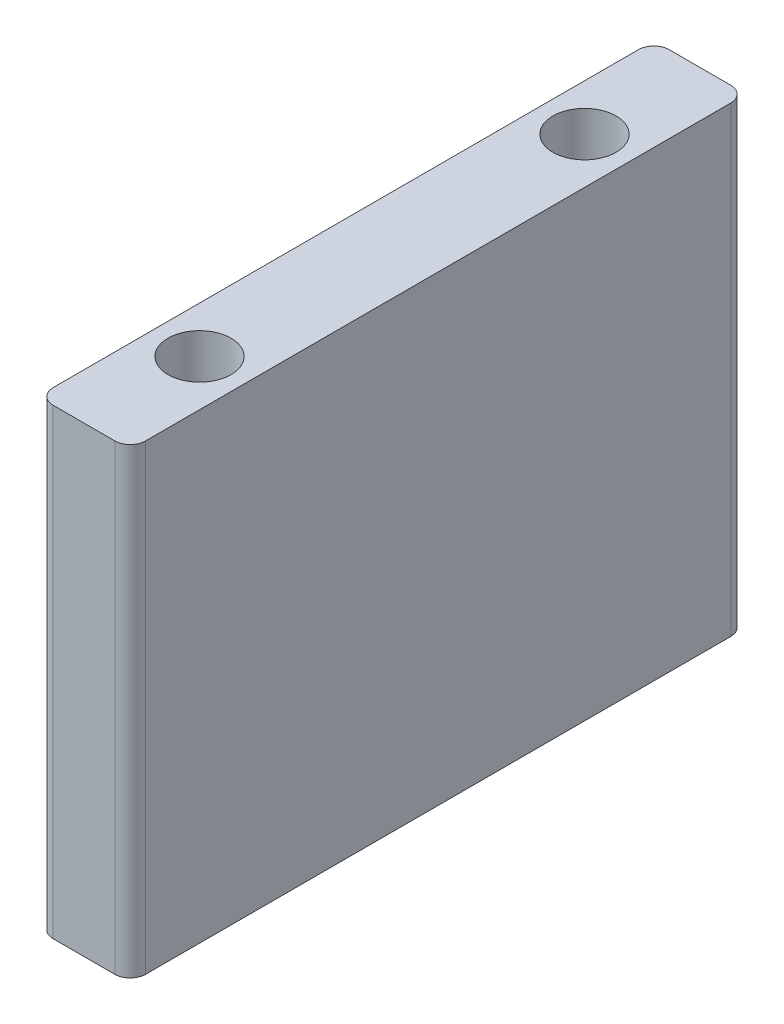
ISO-10303-21;
HEADER;
FILE_DESCRIPTION(('STEP AP214'),'2;1');
FILE_NAME('part.step','',(''),(''),'','','');
FILE_SCHEMA(('AUTOMOTIVE_DESIGN { 1 0 10303 214 1 1 1 1 }'));
ENDSEC;
DATA;
#1=APPLICATION_CONTEXT('core data for automotive mechanical design processes');
#2=APPLICATION_PROTOCOL_DEFINITION('international standard','automotive_design',2000,#1);
#3=PRODUCT_CONTEXT('',#1,'mechanical');
#4=PRODUCT('Part','Part','',(#3));
#5=PRODUCT_RELATED_PRODUCT_CATEGORY('part','',(#4));
#6=PRODUCT_DEFINITION_FORMATION('','',#4);
#7=PRODUCT_DEFINITION_CONTEXT('part definition',#1,'design');
#8=PRODUCT_DEFINITION('design','',#6,#7);
#9=PRODUCT_DEFINITION_SHAPE('','',#8);
#10=(LENGTH_UNIT() NAMED_UNIT(*) SI_UNIT(.MILLI.,.METRE.));
#11=(NAMED_UNIT(*) PLANE_ANGLE_UNIT() SI_UNIT($,.RADIAN.));
#12=(NAMED_UNIT(*) SI_UNIT($,.STERADIAN.) SOLID_ANGLE_UNIT());
#13=UNCERTAINTY_MEASURE_WITH_UNIT(LENGTH_MEASURE(1.E-05),#10,'distance_accuracy_value','');
#14=(GEOMETRIC_REPRESENTATION_CONTEXT(3) GLOBAL_UNCERTAINTY_ASSIGNED_CONTEXT((#13)) GLOBAL_UNIT_ASSIGNED_CONTEXT((#10,
#11,#12)) REPRESENTATION_CONTEXT('',''));
#15=CARTESIAN_POINT('',(0.,0.,0.));
#16=DIRECTION('',(0.,0.,1.));
#17=DIRECTION('',(1.,0.,0.));
#18=AXIS2_PLACEMENT_3D('',#15,#16,#17);
#19=CARTESIAN_POINT('',(2.00000000000001,30.,19.));
#20=DIRECTION('',(0.,1.,0.));
#21=DIRECTION('',(0.,0.,1.));
#22=AXIS2_PLACEMENT_3D('',#19,#20,#21);
#23=PLANE('',#22);
#24=CARTESIAN_POINT('',(0.,30.,-12.5));
#25=DIRECTION('',(0.,1.,0.));
#26=DIRECTION('',(0.,0.,1.));
#27=AXIS2_PLACEMENT_3D('',#24,#25,#26);
#28=CIRCLE('',#27,2.05);
#29=CARTESIAN_POINT('',(0.,30.,-10.45));
#30=VERTEX_POINT('',#29);
#31=EDGE_CURVE('E136',#30,#30,#28,.T.);
#32=ORIENTED_EDGE('',*,*,#31,.F.);
#33=EDGE_LOOP('',(#32));
#34=FACE_BOUND('',#33,.T.);
#35=CARTESIAN_POINT('',(2.00000000000001,30.,19.));
#36=DIRECTION('',(0.,1.,0.));
#37=DIRECTION('',(0.,0.,1.));
#38=AXIS2_PLACEMENT_3D('',#35,#36,#37);
#39=CIRCLE('',#38,1.);
#40=CARTESIAN_POINT('',(2.00000000000001,30.,20.));
#41=VERTEX_POINT('',#40);
#42=CARTESIAN_POINT('',(3.00000000000001,30.,19.));
#43=VERTEX_POINT('',#42);
#44=EDGE_CURVE('E147',#41,#43,#39,.T.);
#45=ORIENTED_EDGE('',*,*,#44,.T.);
#46=DIRECTION('',(0.,0.,-1.));
#47=VECTOR('',#46,1.);
#48=CARTESIAN_POINT('',(3.,30.,-19.));
#49=LINE('',#48,#47);
#50=CARTESIAN_POINT('',(3.00000000000001,30.,-19.));
#51=VERTEX_POINT('',#50);
#52=EDGE_CURVE('E95',#43,#51,#49,.T.);
#53=ORIENTED_EDGE('',*,*,#52,.T.);
#54=CARTESIAN_POINT('',(2.00000000000001,30.,-19.));
#55=DIRECTION('',(0.,1.,0.));
#56=DIRECTION('',(0.,0.,-1.));
#57=AXIS2_PLACEMENT_3D('',#54,#55,#56);
#58=CIRCLE('',#57,0.999999999999998);
#59=CARTESIAN_POINT('',(2.00000000000001,30.,-20.));
#60=VERTEX_POINT('',#59);
#61=EDGE_CURVE('E162',#51,#60,#58,.T.);
#62=ORIENTED_EDGE('',*,*,#61,.T.);
#63=DIRECTION('',(-1.,0.,0.));
#64=VECTOR('',#63,1.);
#65=CARTESIAN_POINT('',(-2.00000000000001,30.,-20.));
#66=LINE('',#65,#64);
#67=CARTESIAN_POINT('',(-2.00000000000001,30.,-20.));
#68=VERTEX_POINT('',#67);
#69=EDGE_CURVE('E175',#60,#68,#66,.T.);
#70=ORIENTED_EDGE('',*,*,#69,.T.);
#71=CARTESIAN_POINT('',(-2.00000000000001,30.,-19.));
#72=DIRECTION('',(0.,1.,0.));
#73=DIRECTION('',(0.,0.,1.));
#74=AXIS2_PLACEMENT_3D('',#71,#72,#73);
#75=CIRCLE('',#74,0.999999999999998);
#76=CARTESIAN_POINT('',(-3.,30.,-19.));
#77=VERTEX_POINT('',#76);
#78=EDGE_CURVE('E114',#68,#77,#75,.T.);
#79=ORIENTED_EDGE('',*,*,#78,.T.);
#80=DIRECTION('',(0.,0.,1.));
#81=VECTOR('',#80,1.);
#82=CARTESIAN_POINT('',(-3.,30.,-19.));
#83=LINE('',#82,#81);
#84=CARTESIAN_POINT('',(-3.,30.,19.));
#85=VERTEX_POINT('',#84);
#86=EDGE_CURVE('E108',#77,#85,#83,.T.);
#87=ORIENTED_EDGE('',*,*,#86,.T.);
#88=CARTESIAN_POINT('',(-2.,30.,19.));
#89=DIRECTION('',(0.,1.,0.));
#90=DIRECTION('',(0.,0.,1.));
#91=AXIS2_PLACEMENT_3D('',#88,#89,#90);
#92=CIRCLE('',#91,1.);
#93=CARTESIAN_POINT('',(-2.00000000000001,30.,20.));
#94=VERTEX_POINT('',#93);
#95=EDGE_CURVE('E112',#85,#94,#92,.T.);
#96=ORIENTED_EDGE('',*,*,#95,.T.);
#97=DIRECTION('',(1.,0.,0.));
#98=VECTOR('',#97,1.);
#99=CARTESIAN_POINT('',(-2.00000000000001,30.,20.));
#100=LINE('',#99,#98);
#101=EDGE_CURVE('E52',#94,#41,#100,.T.);
#102=ORIENTED_EDGE('',*,*,#101,.T.);
#103=EDGE_LOOP('',(#45,#53,#62,#70,#79,#87,#96,#102));
#104=FACE_BOUND('',#103,.T.);
#105=CARTESIAN_POINT('',(0.,30.,12.5));
#106=DIRECTION('',(0.,1.,0.));
#107=DIRECTION('',(0.,0.,-1.));
#108=AXIS2_PLACEMENT_3D('',#105,#106,#107);
#109=CIRCLE('',#108,2.05);
#110=CARTESIAN_POINT('',(0.,30.,10.45));
#111=VERTEX_POINT('',#110);
#112=EDGE_CURVE('E184',#111,#111,#109,.T.);
#113=ORIENTED_EDGE('',*,*,#112,.F.);
#114=EDGE_LOOP('',(#113));
#115=FACE_BOUND('',#114,.T.);
#116=ADVANCED_FACE('F35',(#34,#104,#115),#23,.T.);
#117=CARTESIAN_POINT('',(2.00000000000001,0.,19.));
#118=DIRECTION('',(0.,1.,0.));
#119=DIRECTION('',(0.,0.,1.));
#120=AXIS2_PLACEMENT_3D('',#117,#118,#119);
#121=PLANE('',#120);
#122=CARTESIAN_POINT('',(2.00000000000001,0.,19.));
#123=DIRECTION('',(0.,1.,0.));
#124=DIRECTION('',(0.,0.,1.));
#125=AXIS2_PLACEMENT_3D('',#122,#123,#124);
#126=CIRCLE('',#125,1.);
#127=CARTESIAN_POINT('',(2.00000000000001,0.,20.));
#128=VERTEX_POINT('',#127);
#129=CARTESIAN_POINT('',(3.00000000000001,0.,19.));
#130=VERTEX_POINT('',#129);
#131=EDGE_CURVE('E132',#128,#130,#126,.T.);
#132=ORIENTED_EDGE('',*,*,#131,.F.);
#133=DIRECTION('',(1.,0.,0.));
#134=VECTOR('',#133,1.);
#135=CARTESIAN_POINT('',(-2.00000000000001,0.,20.));
#136=LINE('',#135,#134);
#137=CARTESIAN_POINT('',(-2.00000000000001,0.,20.));
#138=VERTEX_POINT('',#137);
#139=EDGE_CURVE('E87',#138,#128,#136,.T.);
#140=ORIENTED_EDGE('',*,*,#139,.F.);
#141=CARTESIAN_POINT('',(-2.,0.,19.));
#142=DIRECTION('',(0.,1.,0.));
#143=DIRECTION('',(0.,0.,1.));
#144=AXIS2_PLACEMENT_3D('',#141,#142,#143);
#145=CIRCLE('',#144,1.);
#146=CARTESIAN_POINT('',(-3.,0.,19.));
#147=VERTEX_POINT('',#146);
#148=EDGE_CURVE('E81',#147,#138,#145,.T.);
#149=ORIENTED_EDGE('',*,*,#148,.F.);
#150=DIRECTION('',(0.,0.,1.));
#151=VECTOR('',#150,1.);
#152=CARTESIAN_POINT('',(-3.,0.,-19.));
#153=LINE('',#152,#151);
#154=CARTESIAN_POINT('',(-3.,0.,-19.));
#155=VERTEX_POINT('',#154);
#156=EDGE_CURVE('E122',#155,#147,#153,.T.);
#157=ORIENTED_EDGE('',*,*,#156,.F.);
#158=CARTESIAN_POINT('',(-2.00000000000001,0.,-19.));
#159=DIRECTION('',(0.,1.,0.));
#160=DIRECTION('',(0.,0.,1.));
#161=AXIS2_PLACEMENT_3D('',#158,#159,#160);
#162=CIRCLE('',#161,0.999999999999998);
#163=CARTESIAN_POINT('',(-2.00000000000001,0.,-20.));
#164=VERTEX_POINT('',#163);
#165=EDGE_CURVE('E142',#164,#155,#162,.T.);
#166=ORIENTED_EDGE('',*,*,#165,.F.);
#167=DIRECTION('',(-1.,0.,0.));
#168=VECTOR('',#167,1.);
#169=CARTESIAN_POINT('',(-2.00000000000001,0.,-20.));
#170=LINE('',#169,#168);
#171=CARTESIAN_POINT('',(2.00000000000001,0.,-20.));
#172=VERTEX_POINT('',#171);
#173=EDGE_CURVE('E140',#172,#164,#170,.T.);
#174=ORIENTED_EDGE('',*,*,#173,.F.);
#175=CARTESIAN_POINT('',(2.00000000000001,0.,-19.));
#176=DIRECTION('',(0.,1.,0.));
#177=DIRECTION('',(0.,0.,-1.));
#178=AXIS2_PLACEMENT_3D('',#175,#176,#177);
#179=CIRCLE('',#178,0.999999999999998);
#180=CARTESIAN_POINT('',(3.00000000000001,0.,-19.));
#181=VERTEX_POINT('',#180);
#182=EDGE_CURVE('E138',#181,#172,#179,.T.);
#183=ORIENTED_EDGE('',*,*,#182,.F.);
#184=DIRECTION('',(0.,0.,-1.));
#185=VECTOR('',#184,1.);
#186=CARTESIAN_POINT('',(3.,0.,-19.));
#187=LINE('',#186,#185);
#188=EDGE_CURVE('E135',#130,#181,#187,.T.);
#189=ORIENTED_EDGE('',*,*,#188,.F.);
#190=EDGE_LOOP('',(#132,#140,#149,#157,#166,#174,#183,#189));
#191=FACE_BOUND('',#190,.T.);
#192=CARTESIAN_POINT('',(0.,0.,-12.5));
#193=DIRECTION('',(0.,1.,0.));
#194=DIRECTION('',(0.,0.,1.));
#195=AXIS2_PLACEMENT_3D('',#192,#193,#194);
#196=CIRCLE('',#195,2.05);
#197=CARTESIAN_POINT('',(0.,0.,-10.45));
#198=VERTEX_POINT('',#197);
#199=EDGE_CURVE('E181',#198,#198,#196,.T.);
#200=ORIENTED_EDGE('',*,*,#199,.T.);
#201=EDGE_LOOP('',(#200));
#202=FACE_BOUND('',#201,.T.);
#203=CARTESIAN_POINT('',(0.,0.,12.5));
#204=DIRECTION('',(0.,1.,0.));
#205=DIRECTION('',(0.,0.,-1.));
#206=AXIS2_PLACEMENT_3D('',#203,#204,#205);
#207=CIRCLE('',#206,2.05);
#208=CARTESIAN_POINT('',(0.,0.,10.45));
#209=VERTEX_POINT('',#208);
#210=EDGE_CURVE('E187',#209,#209,#207,.T.);
#211=ORIENTED_EDGE('',*,*,#210,.T.);
#212=EDGE_LOOP('',(#211));
#213=FACE_BOUND('',#212,.T.);
#214=ADVANCED_FACE('F166',(#191,#202,#213),#121,.F.);
#215=CARTESIAN_POINT('',(2.00000000000001,30.,19.));
#216=DIRECTION('',(0.,-1.,0.));
#217=DIRECTION('',(0.,0.,-1.));
#218=AXIS2_PLACEMENT_3D('',#215,#216,#217);
#219=CYLINDRICAL_SURFACE('',#218,1.);
#220=ORIENTED_EDGE('',*,*,#131,.T.);
#221=DIRECTION('',(0.,-1.,0.));
#222=VECTOR('',#221,1.);
#223=CARTESIAN_POINT('',(3.00000000000001,30.,19.));
#224=LINE('',#223,#222);
#225=EDGE_CURVE('E11',#43,#130,#224,.T.);
#226=ORIENTED_EDGE('',*,*,#225,.F.);
#227=ORIENTED_EDGE('',*,*,#44,.F.);
#228=DIRECTION('',(0.,-1.,0.));
#229=VECTOR('',#228,1.);
#230=CARTESIAN_POINT('',(2.00000000000001,30.,20.));
#231=LINE('',#230,#229);
#232=EDGE_CURVE('E128',#41,#128,#231,.T.);
#233=ORIENTED_EDGE('',*,*,#232,.T.);
#234=EDGE_LOOP('',(#220,#226,#227,#233));
#235=FACE_BOUND('',#234,.T.);
#236=ADVANCED_FACE('F37',(#235),#219,.T.);
#237=CARTESIAN_POINT('',(3.,30.,-19.));
#238=DIRECTION('',(-1.,0.,0.));
#239=DIRECTION('',(0.,0.,1.));
#240=AXIS2_PLACEMENT_3D('',#237,#238,#239);
#241=PLANE('',#240);
#242=ORIENTED_EDGE('',*,*,#188,.T.);
#243=DIRECTION('',(0.,-1.,0.));
#244=VECTOR('',#243,1.);
#245=CARTESIAN_POINT('',(3.00000000000001,30.,-19.));
#246=LINE('',#245,#244);
#247=EDGE_CURVE('E44',#51,#181,#246,.T.);
#248=ORIENTED_EDGE('',*,*,#247,.F.);
#249=ORIENTED_EDGE('',*,*,#52,.F.);
#250=ORIENTED_EDGE('',*,*,#225,.T.);
#251=EDGE_LOOP('',(#242,#248,#249,#250));
#252=FACE_BOUND('',#251,.T.);
#253=ADVANCED_FACE('F219',(#252),#241,.F.);
#254=CARTESIAN_POINT('',(2.00000000000001,30.,-19.));
#255=DIRECTION('',(0.,-1.,0.));
#256=DIRECTION('',(0.,0.,-1.));
#257=AXIS2_PLACEMENT_3D('',#254,#255,#256);
#258=CYLINDRICAL_SURFACE('',#257,0.999999999999998);
#259=ORIENTED_EDGE('',*,*,#182,.T.);
#260=DIRECTION('',(0.,-1.,0.));
#261=VECTOR('',#260,1.);
#262=CARTESIAN_POINT('',(2.00000000000001,30.,-20.));
#263=LINE('',#262,#261);
#264=EDGE_CURVE('E154',#60,#172,#263,.T.);
#265=ORIENTED_EDGE('',*,*,#264,.F.);
#266=ORIENTED_EDGE('',*,*,#61,.F.);
#267=ORIENTED_EDGE('',*,*,#247,.T.);
#268=EDGE_LOOP('',(#259,#265,#266,#267));
#269=FACE_BOUND('',#268,.T.);
#270=ADVANCED_FACE('F160',(#269),#258,.T.);
#271=CARTESIAN_POINT('',(-2.00000000000001,30.,-20.));
#272=DIRECTION('',(0.,0.,1.));
#273=DIRECTION('',(1.,0.,0.));
#274=AXIS2_PLACEMENT_3D('',#271,#272,#273);
#275=PLANE('',#274);
#276=ORIENTED_EDGE('',*,*,#173,.T.);
#277=DIRECTION('',(0.,-1.,0.));
#278=VECTOR('',#277,1.);
#279=CARTESIAN_POINT('',(-2.00000000000001,30.,-20.));
#280=LINE('',#279,#278);
#281=EDGE_CURVE('E151',#68,#164,#280,.T.);
#282=ORIENTED_EDGE('',*,*,#281,.F.);
#283=ORIENTED_EDGE('',*,*,#69,.F.);
#284=ORIENTED_EDGE('',*,*,#264,.T.);
#285=EDGE_LOOP('',(#276,#282,#283,#284));
#286=FACE_BOUND('',#285,.T.);
#287=ADVANCED_FACE('F171',(#286),#275,.F.);
#288=CARTESIAN_POINT('',(-2.00000000000001,30.,-19.));
#289=DIRECTION('',(0.,-1.,0.));
#290=DIRECTION('',(0.,0.,-1.));
#291=AXIS2_PLACEMENT_3D('',#288,#289,#290);
#292=CYLINDRICAL_SURFACE('',#291,0.999999999999998);
#293=ORIENTED_EDGE('',*,*,#165,.T.);
#294=DIRECTION('',(0.,-1.,0.));
#295=VECTOR('',#294,1.);
#296=CARTESIAN_POINT('',(-3.,30.,-19.));
#297=LINE('',#296,#295);
#298=EDGE_CURVE('E123',#77,#155,#297,.T.);
#299=ORIENTED_EDGE('',*,*,#298,.F.);
#300=ORIENTED_EDGE('',*,*,#78,.F.);
#301=ORIENTED_EDGE('',*,*,#281,.T.);
#302=EDGE_LOOP('',(#293,#299,#300,#301));
#303=FACE_BOUND('',#302,.T.);
#304=ADVANCED_FACE('F174',(#303),#292,.T.);
#305=CARTESIAN_POINT('',(-3.,30.,-19.));
#306=DIRECTION('',(1.,0.,0.));
#307=DIRECTION('',(0.,0.,-1.));
#308=AXIS2_PLACEMENT_3D('',#305,#306,#307);
#309=PLANE('',#308);
#310=ORIENTED_EDGE('',*,*,#156,.T.);
#311=DIRECTION('',(0.,-1.,0.));
#312=VECTOR('',#311,1.);
#313=CARTESIAN_POINT('',(-3.,30.,19.));
#314=LINE('',#313,#312);
#315=EDGE_CURVE('E119',#85,#147,#314,.T.);
#316=ORIENTED_EDGE('',*,*,#315,.F.);
#317=ORIENTED_EDGE('',*,*,#86,.F.);
#318=ORIENTED_EDGE('',*,*,#298,.T.);
#319=EDGE_LOOP('',(#310,#316,#317,#318));
#320=FACE_BOUND('',#319,.T.);
#321=ADVANCED_FACE('F120',(#320),#309,.F.);
#322=CARTESIAN_POINT('',(-2.,30.,19.));
#323=DIRECTION('',(0.,-1.,0.));
#324=DIRECTION('',(0.,0.,-1.));
#325=AXIS2_PLACEMENT_3D('',#322,#323,#324);
#326=CYLINDRICAL_SURFACE('',#325,1.);
#327=ORIENTED_EDGE('',*,*,#148,.T.);
#328=DIRECTION('',(0.,-1.,0.));
#329=VECTOR('',#328,1.);
#330=CARTESIAN_POINT('',(-2.00000000000001,30.,20.));
#331=LINE('',#330,#329);
#332=EDGE_CURVE('E124',#94,#138,#331,.T.);
#333=ORIENTED_EDGE('',*,*,#332,.F.);
#334=ORIENTED_EDGE('',*,*,#95,.F.);
#335=ORIENTED_EDGE('',*,*,#315,.T.);
#336=EDGE_LOOP('',(#327,#333,#334,#335));
#337=FACE_BOUND('',#336,.T.);
#338=ADVANCED_FACE('F126',(#337),#326,.T.);
#339=CARTESIAN_POINT('',(-2.00000000000001,30.,20.));
#340=DIRECTION('',(0.,0.,-1.));
#341=DIRECTION('',(-1.,0.,0.));
#342=AXIS2_PLACEMENT_3D('',#339,#340,#341);
#343=PLANE('',#342);
#344=ORIENTED_EDGE('',*,*,#139,.T.);
#345=ORIENTED_EDGE('',*,*,#232,.F.);
#346=ORIENTED_EDGE('',*,*,#101,.F.);
#347=ORIENTED_EDGE('',*,*,#332,.T.);
#348=EDGE_LOOP('',(#344,#345,#346,#347));
#349=FACE_BOUND('',#348,.T.);
#350=ADVANCED_FACE('F207',(#349),#343,.F.);
#351=CARTESIAN_POINT('',(0.,30.,-12.5));
#352=DIRECTION('',(0.,-1.,0.));
#353=DIRECTION('',(0.,0.,-1.));
#354=AXIS2_PLACEMENT_3D('',#351,#352,#353);
#355=CYLINDRICAL_SURFACE('',#354,2.05);
#356=ORIENTED_EDGE('',*,*,#31,.T.);
#357=EDGE_LOOP('',(#356));
#358=FACE_BOUND('',#357,.T.);
#359=ORIENTED_EDGE('',*,*,#199,.F.);
#360=EDGE_LOOP('',(#359));
#361=FACE_BOUND('',#360,.T.);
#362=ADVANCED_FACE('F204',(#358,#361),#355,.F.);
#363=CARTESIAN_POINT('',(0.,30.,12.5));
#364=DIRECTION('',(0.,-1.,0.));
#365=DIRECTION('',(0.,0.,-1.));
#366=AXIS2_PLACEMENT_3D('',#363,#364,#365);
#367=CYLINDRICAL_SURFACE('',#366,2.05);
#368=ORIENTED_EDGE('',*,*,#112,.T.);
#369=EDGE_LOOP('',(#368));
#370=FACE_BOUND('',#369,.T.);
#371=ORIENTED_EDGE('',*,*,#210,.F.);
#372=EDGE_LOOP('',(#371));
#373=FACE_BOUND('',#372,.T.);
#374=ADVANCED_FACE('F193',(#370,#373),#367,.F.);
#375=CLOSED_SHELL('',(#116,#214,#236,#253,#270,#287,#304,#321,#338,#350,#362,#374));
#376=MANIFOLD_SOLID_BREP('B2',#375);
#377=ADVANCED_BREP_SHAPE_REPRESENTATION('',(#18,#376),#14);
#378=SHAPE_DEFINITION_REPRESENTATION(#9,#377);
ENDSEC;
END-ISO-10303-21;
